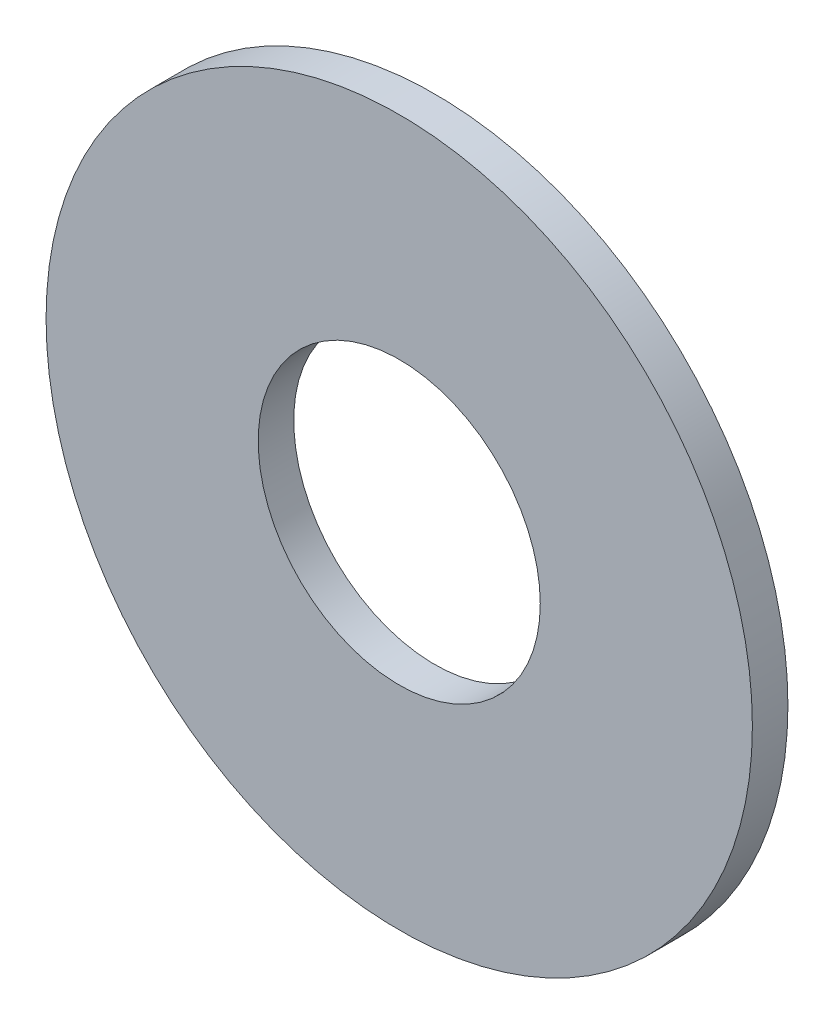
ISO-10303-21;
HEADER;
FILE_DESCRIPTION(('STEP AP214'),'2;1');
FILE_NAME('part.step','',(''),(''),'','','');
FILE_SCHEMA(('AUTOMOTIVE_DESIGN { 1 0 10303 214 1 1 1 1 }'));
ENDSEC;
DATA;
#1=APPLICATION_CONTEXT('core data for automotive mechanical design processes');
#2=APPLICATION_PROTOCOL_DEFINITION('international standard','automotive_design',2000,#1);
#3=PRODUCT_CONTEXT('',#1,'mechanical');
#4=PRODUCT('Part','Part','',(#3));
#5=PRODUCT_RELATED_PRODUCT_CATEGORY('part','',(#4));
#6=PRODUCT_DEFINITION_FORMATION('','',#4);
#7=PRODUCT_DEFINITION_CONTEXT('part definition',#1,'design');
#8=PRODUCT_DEFINITION('design','',#6,#7);
#9=PRODUCT_DEFINITION_SHAPE('','',#8);
#10=(LENGTH_UNIT() NAMED_UNIT(*) SI_UNIT(.MILLI.,.METRE.));
#11=(NAMED_UNIT(*) PLANE_ANGLE_UNIT() SI_UNIT($,.RADIAN.));
#12=(NAMED_UNIT(*) SI_UNIT($,.STERADIAN.) SOLID_ANGLE_UNIT());
#13=UNCERTAINTY_MEASURE_WITH_UNIT(LENGTH_MEASURE(1.E-05),#10,'distance_accuracy_value','');
#14=(GEOMETRIC_REPRESENTATION_CONTEXT(3) GLOBAL_UNCERTAINTY_ASSIGNED_CONTEXT((#13)) GLOBAL_UNIT_ASSIGNED_CONTEXT((#10,
#11,#12)) REPRESENTATION_CONTEXT('',''));
#15=CARTESIAN_POINT('',(0.,0.,0.));
#16=DIRECTION('',(0.,0.,1.));
#17=DIRECTION('',(1.,0.,0.));
#18=AXIS2_PLACEMENT_3D('',#15,#16,#17);
#19=CARTESIAN_POINT('',(0.,0.,-0.4));
#20=DIRECTION('',(0.,0.,1.));
#21=DIRECTION('',(1.,0.,0.));
#22=AXIS2_PLACEMENT_3D('',#19,#20,#21);
#23=CYLINDRICAL_SURFACE('',#22,3.975);
#24=CARTESIAN_POINT('',(0.,0.,-0.4));
#25=DIRECTION('',(0.,0.,1.));
#26=DIRECTION('',(1.,0.,0.));
#27=AXIS2_PLACEMENT_3D('',#24,#25,#26);
#28=CIRCLE('',#27,3.975);
#29=CARTESIAN_POINT('',(3.975,0.,-0.4));
#30=VERTEX_POINT('',#29);
#31=EDGE_CURVE('E10',#30,#30,#28,.T.);
#32=ORIENTED_EDGE('',*,*,#31,.T.);
#33=EDGE_LOOP('',(#32));
#34=FACE_BOUND('',#33,.T.);
#35=CARTESIAN_POINT('',(0.,0.,0.));
#36=DIRECTION('',(0.,0.,1.));
#37=DIRECTION('',(1.,0.,0.));
#38=AXIS2_PLACEMENT_3D('',#35,#36,#37);
#39=CIRCLE('',#38,3.975);
#40=CARTESIAN_POINT('',(3.975,0.,0.));
#41=VERTEX_POINT('',#40);
#42=EDGE_CURVE('E36',#41,#41,#39,.T.);
#43=ORIENTED_EDGE('',*,*,#42,.F.);
#44=EDGE_LOOP('',(#43));
#45=FACE_BOUND('',#44,.T.);
#46=ADVANCED_FACE('F33',(#34,#45),#23,.T.);
#47=CARTESIAN_POINT('',(0.,0.,-0.4));
#48=DIRECTION('',(0.,0.,1.));
#49=DIRECTION('',(1.,0.,0.));
#50=AXIS2_PLACEMENT_3D('',#47,#48,#49);
#51=PLANE('',#50);
#52=CARTESIAN_POINT('',(0.,0.,-0.4));
#53=DIRECTION('',(0.,0.,1.));
#54=DIRECTION('',(1.,0.,0.));
#55=AXIS2_PLACEMENT_3D('',#52,#53,#54);
#56=CIRCLE('',#55,1.5875);
#57=CARTESIAN_POINT('',(1.5875,0.,-0.4));
#58=VERTEX_POINT('',#57);
#59=EDGE_CURVE('E43',#58,#58,#56,.T.);
#60=ORIENTED_EDGE('',*,*,#59,.T.);
#61=EDGE_LOOP('',(#60));
#62=FACE_BOUND('',#61,.T.);
#63=ORIENTED_EDGE('',*,*,#31,.F.);
#64=EDGE_LOOP('',(#63));
#65=FACE_BOUND('',#64,.T.);
#66=ADVANCED_FACE('F51',(#62,#65),#51,.F.);
#67=CARTESIAN_POINT('',(0.,0.,0.));
#68=DIRECTION('',(0.,0.,1.));
#69=DIRECTION('',(1.,0.,0.));
#70=AXIS2_PLACEMENT_3D('',#67,#68,#69);
#71=PLANE('',#70);
#72=CARTESIAN_POINT('',(0.,0.,0.));
#73=DIRECTION('',(0.,0.,1.));
#74=DIRECTION('',(1.,0.,0.));
#75=AXIS2_PLACEMENT_3D('',#72,#73,#74);
#76=CIRCLE('',#75,1.5875);
#77=CARTESIAN_POINT('',(1.5875,0.,0.));
#78=VERTEX_POINT('',#77);
#79=EDGE_CURVE('E45',#78,#78,#76,.T.);
#80=ORIENTED_EDGE('',*,*,#79,.F.);
#81=EDGE_LOOP('',(#80));
#82=FACE_BOUND('',#81,.T.);
#83=ORIENTED_EDGE('',*,*,#42,.T.);
#84=EDGE_LOOP('',(#83));
#85=FACE_BOUND('',#84,.T.);
#86=ADVANCED_FACE('F57',(#82,#85),#71,.T.);
#87=CARTESIAN_POINT('',(0.,0.,-0.4));
#88=DIRECTION('',(0.,0.,1.));
#89=DIRECTION('',(1.,0.,0.));
#90=AXIS2_PLACEMENT_3D('',#87,#88,#89);
#91=CYLINDRICAL_SURFACE('',#90,1.5875);
#92=ORIENTED_EDGE('',*,*,#59,.F.);
#93=EDGE_LOOP('',(#92));
#94=FACE_BOUND('',#93,.T.);
#95=ORIENTED_EDGE('',*,*,#79,.T.);
#96=EDGE_LOOP('',(#95));
#97=FACE_BOUND('',#96,.T.);
#98=ADVANCED_FACE('F54',(#94,#97),#91,.F.);
#99=CLOSED_SHELL('',(#46,#66,#86,#98));
#100=MANIFOLD_SOLID_BREP('B2',#99);
#101=ADVANCED_BREP_SHAPE_REPRESENTATION('',(#18,#100),#14);
#102=SHAPE_DEFINITION_REPRESENTATION(#9,#101);
ENDSEC;
END-ISO-10303-21;
